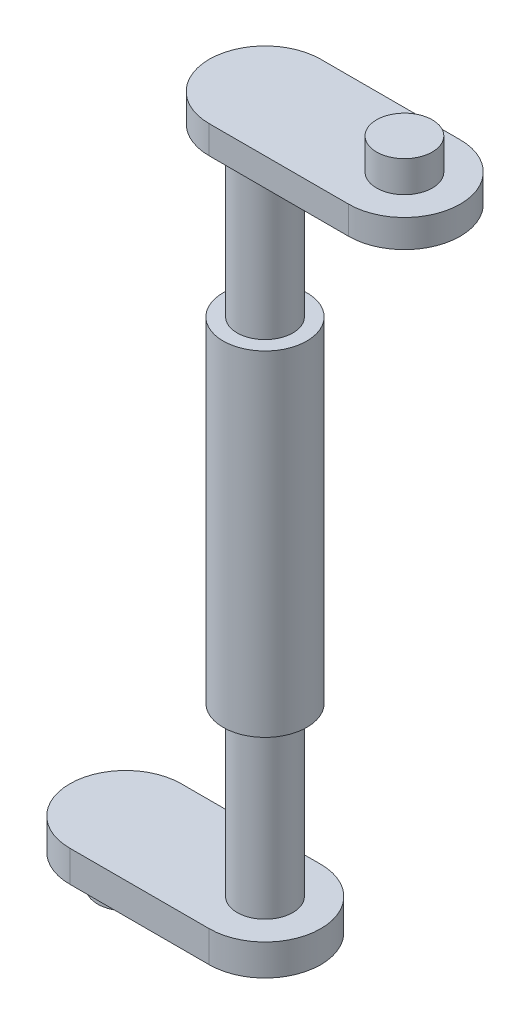
ISO-10303-21;
HEADER;
FILE_DESCRIPTION(('STEP AP214'),'2;1');
FILE_NAME('part.step','',(''),(''),'','','');
FILE_SCHEMA(('AUTOMOTIVE_DESIGN { 1 0 10303 214 1 1 1 1 }'));
ENDSEC;
DATA;
#1=APPLICATION_CONTEXT('core data for automotive mechanical design processes');
#2=APPLICATION_PROTOCOL_DEFINITION('international standard','automotive_design',2000,#1);
#3=PRODUCT_CONTEXT('',#1,'mechanical');
#4=PRODUCT('Part','Part','',(#3));
#5=PRODUCT_RELATED_PRODUCT_CATEGORY('part','',(#4));
#6=PRODUCT_DEFINITION_FORMATION('','',#4);
#7=PRODUCT_DEFINITION_CONTEXT('part definition',#1,'design');
#8=PRODUCT_DEFINITION('design','',#6,#7);
#9=PRODUCT_DEFINITION_SHAPE('','',#8);
#10=(LENGTH_UNIT() NAMED_UNIT(*) SI_UNIT(.MILLI.,.METRE.));
#11=(NAMED_UNIT(*) PLANE_ANGLE_UNIT() SI_UNIT($,.RADIAN.));
#12=(NAMED_UNIT(*) SI_UNIT($,.STERADIAN.) SOLID_ANGLE_UNIT());
#13=UNCERTAINTY_MEASURE_WITH_UNIT(LENGTH_MEASURE(1.E-05),#10,'distance_accuracy_value','');
#14=(GEOMETRIC_REPRESENTATION_CONTEXT(3) GLOBAL_UNCERTAINTY_ASSIGNED_CONTEXT((#13)) GLOBAL_UNIT_ASSIGNED_CONTEXT((#10,
#11,#12)) REPRESENTATION_CONTEXT('',''));
#15=CARTESIAN_POINT('',(0.,0.,0.));
#16=DIRECTION('',(0.,0.,1.));
#17=DIRECTION('',(1.,0.,0.));
#18=AXIS2_PLACEMENT_3D('',#15,#16,#17);
#19=CARTESIAN_POINT('',(0.,30.,0.));
#20=DIRECTION('',(0.,-1.,0.));
#21=DIRECTION('',(0.,0.,-1.));
#22=AXIS2_PLACEMENT_3D('',#19,#20,#21);
#23=CYLINDRICAL_SURFACE('',#22,2.5);
#24=CARTESIAN_POINT('',(0.,15.,0.));
#25=DIRECTION('',(0.,1.,0.));
#26=DIRECTION('',(0.,0.,1.));
#27=AXIS2_PLACEMENT_3D('',#24,#25,#26);
#28=CIRCLE('',#27,2.5);
#29=CARTESIAN_POINT('',(0.,15.,2.5));
#30=VERTEX_POINT('',#29);
#31=EDGE_CURVE('E36',#30,#30,#28,.T.);
#32=ORIENTED_EDGE('',*,*,#31,.T.);
#33=EDGE_LOOP('',(#32));
#34=FACE_BOUND('',#33,.T.);
#35=CARTESIAN_POINT('',(0.,30.,0.));
#36=DIRECTION('',(0.,1.,0.));
#37=DIRECTION('',(0.,0.,1.));
#38=AXIS2_PLACEMENT_3D('',#35,#36,#37);
#39=CIRCLE('',#38,2.5);
#40=CARTESIAN_POINT('',(0.,30.,2.5));
#41=VERTEX_POINT('',#40);
#42=EDGE_CURVE('E42',#41,#41,#39,.T.);
#43=ORIENTED_EDGE('',*,*,#42,.F.);
#44=EDGE_LOOP('',(#43));
#45=FACE_BOUND('',#44,.T.);
#46=ADVANCED_FACE('F33',(#34,#45),#23,.T.);
#47=CARTESIAN_POINT('',(0.,15.,0.));
#48=DIRECTION('',(0.,-1.,0.));
#49=DIRECTION('',(0.,0.,-1.));
#50=AXIS2_PLACEMENT_3D('',#47,#48,#49);
#51=CYLINDRICAL_SURFACE('',#50,3.75);
#52=CARTESIAN_POINT('',(0.,15.,0.));
#53=DIRECTION('',(0.,1.,0.));
#54=DIRECTION('',(0.,0.,1.));
#55=AXIS2_PLACEMENT_3D('',#52,#53,#54);
#56=CIRCLE('',#55,3.75);
#57=CARTESIAN_POINT('',(0.,15.,3.75));
#58=VERTEX_POINT('',#57);
#59=EDGE_CURVE('E170',#58,#58,#56,.T.);
#60=ORIENTED_EDGE('',*,*,#59,.F.);
#61=EDGE_LOOP('',(#60));
#62=FACE_BOUND('',#61,.T.);
#63=CARTESIAN_POINT('',(0.,-15.,0.));
#64=DIRECTION('',(0.,1.,0.));
#65=DIRECTION('',(0.,0.,1.));
#66=AXIS2_PLACEMENT_3D('',#63,#64,#65);
#67=CIRCLE('',#66,3.75);
#68=CARTESIAN_POINT('',(0.,-15.,3.75));
#69=VERTEX_POINT('',#68);
#70=EDGE_CURVE('E169',#69,#69,#67,.T.);
#71=ORIENTED_EDGE('',*,*,#70,.T.);
#72=EDGE_LOOP('',(#71));
#73=FACE_BOUND('',#72,.T.);
#74=ADVANCED_FACE('F187',(#62,#73),#51,.T.);
#75=CARTESIAN_POINT('',(0.,15.,0.));
#76=DIRECTION('',(0.,1.,0.));
#77=DIRECTION('',(0.,0.,1.));
#78=AXIS2_PLACEMENT_3D('',#75,#76,#77);
#79=PLANE('',#78);
#80=ORIENTED_EDGE('',*,*,#31,.F.);
#81=EDGE_LOOP('',(#80));
#82=FACE_BOUND('',#81,.T.);
#83=ORIENTED_EDGE('',*,*,#59,.T.);
#84=EDGE_LOOP('',(#83));
#85=FACE_BOUND('',#84,.T.);
#86=ADVANCED_FACE('F183',(#82,#85),#79,.T.);
#87=CARTESIAN_POINT('',(0.,-15.,0.));
#88=DIRECTION('',(0.,1.,0.));
#89=DIRECTION('',(0.,0.,1.));
#90=AXIS2_PLACEMENT_3D('',#87,#88,#89);
#91=PLANE('',#90);
#92=CARTESIAN_POINT('',(0.,-15.,0.));
#93=DIRECTION('',(0.,1.,0.));
#94=DIRECTION('',(0.,0.,1.));
#95=AXIS2_PLACEMENT_3D('',#92,#93,#94);
#96=CIRCLE('',#95,2.5);
#97=CARTESIAN_POINT('',(0.,-15.,2.5));
#98=VERTEX_POINT('',#97);
#99=EDGE_CURVE('E11',#98,#98,#96,.T.);
#100=ORIENTED_EDGE('',*,*,#99,.T.);
#101=EDGE_LOOP('',(#100));
#102=FACE_BOUND('',#101,.T.);
#103=ORIENTED_EDGE('',*,*,#70,.F.);
#104=EDGE_LOOP('',(#103));
#105=FACE_BOUND('',#104,.T.);
#106=ADVANCED_FACE('F186',(#102,#105),#91,.F.);
#107=CARTESIAN_POINT('',(0.,-30.,0.));
#108=DIRECTION('',(0.,1.,0.));
#109=DIRECTION('',(0.,0.,1.));
#110=AXIS2_PLACEMENT_3D('',#107,#108,#109);
#111=CIRCLE('',#110,2.5);
#112=CARTESIAN_POINT('',(0.,-30.,2.5));
#113=VERTEX_POINT('',#112);
#114=EDGE_CURVE('E134',#113,#113,#111,.T.);
#115=ORIENTED_EDGE('',*,*,#114,.T.);
#116=EDGE_LOOP('',(#115));
#117=FACE_BOUND('',#116,.T.);
#118=ORIENTED_EDGE('',*,*,#99,.F.);
#119=EDGE_LOOP('',(#118));
#120=FACE_BOUND('',#119,.T.);
#121=ADVANCED_FACE('F196',(#117,#120),#23,.T.);
#122=CARTESIAN_POINT('',(0.,32.5,0.));
#123=DIRECTION('',(0.,-1.,0.));
#124=DIRECTION('',(0.,0.,-1.));
#125=AXIS2_PLACEMENT_3D('',#122,#123,#124);
#126=CYLINDRICAL_SURFACE('',#125,5.);
#127=CARTESIAN_POINT('',(0.,30.,0.));
#128=DIRECTION('',(0.,1.,0.));
#129=DIRECTION('',(0.,0.,1.));
#130=AXIS2_PLACEMENT_3D('',#127,#128,#129);
#131=CIRCLE('',#130,5.);
#132=CARTESIAN_POINT('',(0.,30.,-5.));
#133=VERTEX_POINT('',#132);
#134=CARTESIAN_POINT('',(0.,30.,5.));
#135=VERTEX_POINT('',#134);
#136=EDGE_CURVE('E146',#133,#135,#131,.T.);
#137=ORIENTED_EDGE('',*,*,#136,.T.);
#138=DIRECTION('',(0.,-1.,0.));
#139=VECTOR('',#138,1.);
#140=CARTESIAN_POINT('',(0.,32.5,5.));
#141=LINE('',#140,#139);
#142=CARTESIAN_POINT('',(0.,32.5,5.));
#143=VERTEX_POINT('',#142);
#144=EDGE_CURVE('E167',#143,#135,#141,.T.);
#145=ORIENTED_EDGE('',*,*,#144,.F.);
#146=CARTESIAN_POINT('',(0.,32.5,0.));
#147=DIRECTION('',(0.,1.,0.));
#148=DIRECTION('',(0.,0.,1.));
#149=AXIS2_PLACEMENT_3D('',#146,#147,#148);
#150=CIRCLE('',#149,5.);
#151=CARTESIAN_POINT('',(0.,32.5,-5.));
#152=VERTEX_POINT('',#151);
#153=EDGE_CURVE('E149',#152,#143,#150,.T.);
#154=ORIENTED_EDGE('',*,*,#153,.F.);
#155=DIRECTION('',(0.,-1.,0.));
#156=VECTOR('',#155,1.);
#157=CARTESIAN_POINT('',(0.,32.5,-5.));
#158=LINE('',#157,#156);
#159=EDGE_CURVE('E155',#152,#133,#158,.T.);
#160=ORIENTED_EDGE('',*,*,#159,.T.);
#161=EDGE_LOOP('',(#137,#145,#154,#160));
#162=FACE_BOUND('',#161,.T.);
#163=ADVANCED_FACE('F202',(#162),#126,.T.);
#164=CARTESIAN_POINT('',(0.,32.5,5.));
#165=DIRECTION('',(0.,0.,-1.));
#166=DIRECTION('',(-1.,0.,0.));
#167=AXIS2_PLACEMENT_3D('',#164,#165,#166);
#168=PLANE('',#167);
#169=DIRECTION('',(1.,0.,0.));
#170=VECTOR('',#169,1.);
#171=CARTESIAN_POINT('',(0.,30.,5.));
#172=LINE('',#171,#170);
#173=CARTESIAN_POINT('',(12.5,30.,5.));
#174=VERTEX_POINT('',#173);
#175=EDGE_CURVE('E158',#135,#174,#172,.T.);
#176=ORIENTED_EDGE('',*,*,#175,.T.);
#177=DIRECTION('',(0.,-1.,0.));
#178=VECTOR('',#177,1.);
#179=CARTESIAN_POINT('',(12.5,32.5,5.));
#180=LINE('',#179,#178);
#181=CARTESIAN_POINT('',(12.5,32.5,5.));
#182=VERTEX_POINT('',#181);
#183=EDGE_CURVE('E165',#182,#174,#180,.T.);
#184=ORIENTED_EDGE('',*,*,#183,.F.);
#185=DIRECTION('',(1.,0.,0.));
#186=VECTOR('',#185,1.);
#187=CARTESIAN_POINT('',(0.,32.5,5.));
#188=LINE('',#187,#186);
#189=EDGE_CURVE('E82',#143,#182,#188,.T.);
#190=ORIENTED_EDGE('',*,*,#189,.F.);
#191=ORIENTED_EDGE('',*,*,#144,.T.);
#192=EDGE_LOOP('',(#176,#184,#190,#191));
#193=FACE_BOUND('',#192,.T.);
#194=ADVANCED_FACE('F234',(#193),#168,.F.);
#195=CARTESIAN_POINT('',(12.5,32.5,0.));
#196=DIRECTION('',(0.,-1.,0.));
#197=DIRECTION('',(0.,0.,-1.));
#198=AXIS2_PLACEMENT_3D('',#195,#196,#197);
#199=CYLINDRICAL_SURFACE('',#198,5.);
#200=CARTESIAN_POINT('',(12.5,30.,0.));
#201=DIRECTION('',(0.,1.,0.));
#202=DIRECTION('',(0.,0.,1.));
#203=AXIS2_PLACEMENT_3D('',#200,#201,#202);
#204=CIRCLE('',#203,5.);
#205=CARTESIAN_POINT('',(12.5,30.,-5.));
#206=VERTEX_POINT('',#205);
#207=EDGE_CURVE('E68',#174,#206,#204,.T.);
#208=ORIENTED_EDGE('',*,*,#207,.T.);
#209=DIRECTION('',(0.,-1.,0.));
#210=VECTOR('',#209,1.);
#211=CARTESIAN_POINT('',(12.5,32.5,-5.));
#212=LINE('',#211,#210);
#213=CARTESIAN_POINT('',(12.5,32.5,-5.));
#214=VERTEX_POINT('',#213);
#215=EDGE_CURVE('E163',#214,#206,#212,.T.);
#216=ORIENTED_EDGE('',*,*,#215,.F.);
#217=CARTESIAN_POINT('',(12.5,32.5,0.));
#218=DIRECTION('',(0.,1.,0.));
#219=DIRECTION('',(0.,0.,1.));
#220=AXIS2_PLACEMENT_3D('',#217,#218,#219);
#221=CIRCLE('',#220,5.);
#222=EDGE_CURVE('E152',#182,#214,#221,.T.);
#223=ORIENTED_EDGE('',*,*,#222,.F.);
#224=ORIENTED_EDGE('',*,*,#183,.T.);
#225=EDGE_LOOP('',(#208,#216,#223,#224));
#226=FACE_BOUND('',#225,.T.);
#227=ADVANCED_FACE('F244',(#226),#199,.T.);
#228=CARTESIAN_POINT('',(0.,32.5,-5.));
#229=DIRECTION('',(0.,0.,1.));
#230=DIRECTION('',(1.,0.,0.));
#231=AXIS2_PLACEMENT_3D('',#228,#229,#230);
#232=PLANE('',#231);
#233=DIRECTION('',(-1.,0.,0.));
#234=VECTOR('',#233,1.);
#235=CARTESIAN_POINT('',(0.,30.,-5.));
#236=LINE('',#235,#234);
#237=EDGE_CURVE('E74',#206,#133,#236,.T.);
#238=ORIENTED_EDGE('',*,*,#237,.T.);
#239=ORIENTED_EDGE('',*,*,#159,.F.);
#240=DIRECTION('',(-1.,0.,0.));
#241=VECTOR('',#240,1.);
#242=CARTESIAN_POINT('',(0.,32.5,-5.));
#243=LINE('',#242,#241);
#244=EDGE_CURVE('E50',#214,#152,#243,.T.);
#245=ORIENTED_EDGE('',*,*,#244,.F.);
#246=ORIENTED_EDGE('',*,*,#215,.T.);
#247=EDGE_LOOP('',(#238,#239,#245,#246));
#248=FACE_BOUND('',#247,.T.);
#249=ADVANCED_FACE('F253',(#248),#232,.F.);
#250=CARTESIAN_POINT('',(0.,32.5,0.));
#251=DIRECTION('',(0.,1.,0.));
#252=DIRECTION('',(0.,0.,1.));
#253=AXIS2_PLACEMENT_3D('',#250,#251,#252);
#254=PLANE('',#253);
#255=CARTESIAN_POINT('',(12.5,32.5,0.));
#256=DIRECTION('',(0.,1.,0.));
#257=DIRECTION('',(0.,0.,1.));
#258=AXIS2_PLACEMENT_3D('',#255,#256,#257);
#259=CIRCLE('',#258,2.5);
#260=CARTESIAN_POINT('',(12.5,32.5,2.5));
#261=VERTEX_POINT('',#260);
#262=EDGE_CURVE('E137',#261,#261,#259,.T.);
#263=ORIENTED_EDGE('',*,*,#262,.F.);
#264=EDGE_LOOP('',(#263));
#265=FACE_BOUND('',#264,.T.);
#266=ORIENTED_EDGE('',*,*,#153,.T.);
#267=ORIENTED_EDGE('',*,*,#189,.T.);
#268=ORIENTED_EDGE('',*,*,#222,.T.);
#269=ORIENTED_EDGE('',*,*,#244,.T.);
#270=EDGE_LOOP('',(#266,#267,#268,#269));
#271=FACE_BOUND('',#270,.T.);
#272=ADVANCED_FACE('F262',(#265,#271),#254,.T.);
#273=CARTESIAN_POINT('',(0.,30.,0.));
#274=DIRECTION('',(0.,1.,0.));
#275=DIRECTION('',(0.,0.,1.));
#276=AXIS2_PLACEMENT_3D('',#273,#274,#275);
#277=PLANE('',#276);
#278=ORIENTED_EDGE('',*,*,#42,.T.);
#279=EDGE_LOOP('',(#278));
#280=FACE_BOUND('',#279,.T.);
#281=ORIENTED_EDGE('',*,*,#136,.F.);
#282=ORIENTED_EDGE('',*,*,#237,.F.);
#283=ORIENTED_EDGE('',*,*,#207,.F.);
#284=ORIENTED_EDGE('',*,*,#175,.F.);
#285=EDGE_LOOP('',(#281,#282,#283,#284));
#286=FACE_BOUND('',#285,.T.);
#287=ADVANCED_FACE('F269',(#280,#286),#277,.F.);
#288=CARTESIAN_POINT('',(12.5,35.3,0.));
#289=DIRECTION('',(0.,-1.,0.));
#290=DIRECTION('',(0.,0.,-1.));
#291=AXIS2_PLACEMENT_3D('',#288,#289,#290);
#292=CYLINDRICAL_SURFACE('',#291,2.5);
#293=CARTESIAN_POINT('',(12.5,35.3,0.));
#294=DIRECTION('',(0.,1.,0.));
#295=DIRECTION('',(0.,0.,1.));
#296=AXIS2_PLACEMENT_3D('',#293,#294,#295);
#297=CIRCLE('',#296,2.5);
#298=CARTESIAN_POINT('',(12.5,35.3,2.5));
#299=VERTEX_POINT('',#298);
#300=EDGE_CURVE('E143',#299,#299,#297,.T.);
#301=ORIENTED_EDGE('',*,*,#300,.F.);
#302=EDGE_LOOP('',(#301));
#303=FACE_BOUND('',#302,.T.);
#304=ORIENTED_EDGE('',*,*,#262,.T.);
#305=EDGE_LOOP('',(#304));
#306=FACE_BOUND('',#305,.T.);
#307=ADVANCED_FACE('F274',(#303,#306),#292,.T.);
#308=CARTESIAN_POINT('',(12.5,35.3,0.));
#309=DIRECTION('',(0.,1.,0.));
#310=DIRECTION('',(0.,0.,1.));
#311=AXIS2_PLACEMENT_3D('',#308,#309,#310);
#312=PLANE('',#311);
#313=ORIENTED_EDGE('',*,*,#300,.T.);
#314=EDGE_LOOP('',(#313));
#315=FACE_BOUND('',#314,.T.);
#316=ADVANCED_FACE('F290',(#315),#312,.T.);
#317=CARTESIAN_POINT('',(0.,-32.8,0.));
#318=DIRECTION('',(0.,1.,0.));
#319=DIRECTION('',(0.,0.,1.));
#320=AXIS2_PLACEMENT_3D('',#317,#318,#319);
#321=CYLINDRICAL_SURFACE('',#320,5.);
#322=CARTESIAN_POINT('',(0.,-30.,0.));
#323=DIRECTION('',(0.,-1.,0.));
#324=DIRECTION('',(0.,0.,-1.));
#325=AXIS2_PLACEMENT_3D('',#322,#323,#324);
#326=CIRCLE('',#325,5.);
#327=CARTESIAN_POINT('',(0.,-30.,-5.));
#328=VERTEX_POINT('',#327);
#329=CARTESIAN_POINT('',(0.,-30.,5.));
#330=VERTEX_POINT('',#329);
#331=EDGE_CURVE('E133',#328,#330,#326,.T.);
#332=ORIENTED_EDGE('',*,*,#331,.T.);
#333=DIRECTION('',(0.,1.,0.));
#334=VECTOR('',#333,1.);
#335=CARTESIAN_POINT('',(0.,-32.8,5.));
#336=LINE('',#335,#334);
#337=CARTESIAN_POINT('',(0.,-32.8,5.));
#338=VERTEX_POINT('',#337);
#339=EDGE_CURVE('E113',#338,#330,#336,.T.);
#340=ORIENTED_EDGE('',*,*,#339,.F.);
#341=CARTESIAN_POINT('',(0.,-32.8,0.));
#342=DIRECTION('',(0.,-1.,0.));
#343=DIRECTION('',(0.,0.,-1.));
#344=AXIS2_PLACEMENT_3D('',#341,#342,#343);
#345=CIRCLE('',#344,5.);
#346=CARTESIAN_POINT('',(0.,-32.8,-5.));
#347=VERTEX_POINT('',#346);
#348=EDGE_CURVE('E120',#347,#338,#345,.T.);
#349=ORIENTED_EDGE('',*,*,#348,.F.);
#350=DIRECTION('',(0.,1.,0.));
#351=VECTOR('',#350,1.);
#352=CARTESIAN_POINT('',(0.,-32.8,-5.));
#353=LINE('',#352,#351);
#354=EDGE_CURVE('E390',#347,#328,#353,.T.);
#355=ORIENTED_EDGE('',*,*,#354,.T.);
#356=EDGE_LOOP('',(#332,#340,#349,#355));
#357=FACE_BOUND('',#356,.T.);
#358=ADVANCED_FACE('F131',(#357),#321,.T.);
#359=CARTESIAN_POINT('',(0.,-32.8,5.));
#360=DIRECTION('',(0.,0.,-1.));
#361=DIRECTION('',(-1.,0.,0.));
#362=AXIS2_PLACEMENT_3D('',#359,#360,#361);
#363=PLANE('',#362);
#364=DIRECTION('',(-1.,0.,0.));
#365=VECTOR('',#364,1.);
#366=CARTESIAN_POINT('',(0.,-30.,5.));
#367=LINE('',#366,#365);
#368=CARTESIAN_POINT('',(-12.5,-30.,5.));
#369=VERTEX_POINT('',#368);
#370=EDGE_CURVE('E384',#330,#369,#367,.T.);
#371=ORIENTED_EDGE('',*,*,#370,.T.);
#372=DIRECTION('',(0.,1.,0.));
#373=VECTOR('',#372,1.);
#374=CARTESIAN_POINT('',(-12.5,-32.8,5.));
#375=LINE('',#374,#373);
#376=CARTESIAN_POINT('',(-12.5,-32.8,5.));
#377=VERTEX_POINT('',#376);
#378=EDGE_CURVE('E116',#377,#369,#375,.T.);
#379=ORIENTED_EDGE('',*,*,#378,.F.);
#380=DIRECTION('',(-1.,0.,0.));
#381=VECTOR('',#380,1.);
#382=CARTESIAN_POINT('',(0.,-32.8,5.));
#383=LINE('',#382,#381);
#384=EDGE_CURVE('E109',#338,#377,#383,.T.);
#385=ORIENTED_EDGE('',*,*,#384,.F.);
#386=ORIENTED_EDGE('',*,*,#339,.T.);
#387=EDGE_LOOP('',(#371,#379,#385,#386));
#388=FACE_BOUND('',#387,.T.);
#389=ADVANCED_FACE('F111',(#388),#363,.F.);
#390=CARTESIAN_POINT('',(-12.5,-32.8,0.));
#391=DIRECTION('',(0.,1.,0.));
#392=DIRECTION('',(0.,0.,1.));
#393=AXIS2_PLACEMENT_3D('',#390,#391,#392);
#394=CYLINDRICAL_SURFACE('',#393,5.);
#395=CARTESIAN_POINT('',(-12.5,-30.,0.));
#396=DIRECTION('',(0.,-1.,0.));
#397=DIRECTION('',(0.,0.,-1.));
#398=AXIS2_PLACEMENT_3D('',#395,#396,#397);
#399=CIRCLE('',#398,5.);
#400=CARTESIAN_POINT('',(-12.5,-30.,-5.));
#401=VERTEX_POINT('',#400);
#402=EDGE_CURVE('E393',#369,#401,#399,.T.);
#403=ORIENTED_EDGE('',*,*,#402,.T.);
#404=DIRECTION('',(0.,1.,0.));
#405=VECTOR('',#404,1.);
#406=CARTESIAN_POINT('',(-12.5,-32.8,-5.));
#407=LINE('',#406,#405);
#408=CARTESIAN_POINT('',(-12.5,-32.8,-5.));
#409=VERTEX_POINT('',#408);
#410=EDGE_CURVE('E139',#409,#401,#407,.T.);
#411=ORIENTED_EDGE('',*,*,#410,.F.);
#412=CARTESIAN_POINT('',(-12.5,-32.8,0.));
#413=DIRECTION('',(0.,-1.,0.));
#414=DIRECTION('',(0.,0.,-1.));
#415=AXIS2_PLACEMENT_3D('',#412,#413,#414);
#416=CIRCLE('',#415,5.);
#417=EDGE_CURVE('E119',#377,#409,#416,.T.);
#418=ORIENTED_EDGE('',*,*,#417,.F.);
#419=ORIENTED_EDGE('',*,*,#378,.T.);
#420=EDGE_LOOP('',(#403,#411,#418,#419));
#421=FACE_BOUND('',#420,.T.);
#422=ADVANCED_FACE('F317',(#421),#394,.T.);
#423=CARTESIAN_POINT('',(0.,-32.8,-5.));
#424=DIRECTION('',(0.,0.,1.));
#425=DIRECTION('',(1.,0.,0.));
#426=AXIS2_PLACEMENT_3D('',#423,#424,#425);
#427=PLANE('',#426);
#428=DIRECTION('',(1.,0.,0.));
#429=VECTOR('',#428,1.);
#430=CARTESIAN_POINT('',(0.,-30.,-5.));
#431=LINE('',#430,#429);
#432=EDGE_CURVE('E129',#401,#328,#431,.T.);
#433=ORIENTED_EDGE('',*,*,#432,.T.);
#434=ORIENTED_EDGE('',*,*,#354,.F.);
#435=DIRECTION('',(1.,0.,0.));
#436=VECTOR('',#435,1.);
#437=CARTESIAN_POINT('',(0.,-32.8,-5.));
#438=LINE('',#437,#436);
#439=EDGE_CURVE('E125',#409,#347,#438,.T.);
#440=ORIENTED_EDGE('',*,*,#439,.F.);
#441=ORIENTED_EDGE('',*,*,#410,.T.);
#442=EDGE_LOOP('',(#433,#434,#440,#441));
#443=FACE_BOUND('',#442,.T.);
#444=ADVANCED_FACE('F326',(#443),#427,.F.);
#445=CARTESIAN_POINT('',(0.,-32.8,0.));
#446=DIRECTION('',(0.,-1.,0.));
#447=DIRECTION('',(0.,0.,-1.));
#448=AXIS2_PLACEMENT_3D('',#445,#446,#447);
#449=PLANE('',#448);
#450=CARTESIAN_POINT('',(-12.5,-32.8,0.));
#451=DIRECTION('',(0.,-1.,0.));
#452=DIRECTION('',(0.,0.,-1.));
#453=AXIS2_PLACEMENT_3D('',#450,#451,#452);
#454=CIRCLE('',#453,2.5);
#455=CARTESIAN_POINT('',(-12.5,-32.8,-2.5));
#456=VERTEX_POINT('',#455);
#457=EDGE_CURVE('E382',#456,#456,#454,.T.);
#458=ORIENTED_EDGE('',*,*,#457,.F.);
#459=EDGE_LOOP('',(#458));
#460=FACE_BOUND('',#459,.T.);
#461=ORIENTED_EDGE('',*,*,#348,.T.);
#462=ORIENTED_EDGE('',*,*,#384,.T.);
#463=ORIENTED_EDGE('',*,*,#417,.T.);
#464=ORIENTED_EDGE('',*,*,#439,.T.);
#465=EDGE_LOOP('',(#461,#462,#463,#464));
#466=FACE_BOUND('',#465,.T.);
#467=ADVANCED_FACE('F123',(#460,#466),#449,.T.);
#468=CARTESIAN_POINT('',(0.,-30.,0.));
#469=DIRECTION('',(0.,-1.,0.));
#470=DIRECTION('',(0.,0.,-1.));
#471=AXIS2_PLACEMENT_3D('',#468,#469,#470);
#472=PLANE('',#471);
#473=ORIENTED_EDGE('',*,*,#114,.F.);
#474=EDGE_LOOP('',(#473));
#475=FACE_BOUND('',#474,.T.);
#476=ORIENTED_EDGE('',*,*,#331,.F.);
#477=ORIENTED_EDGE('',*,*,#432,.F.);
#478=ORIENTED_EDGE('',*,*,#402,.F.);
#479=ORIENTED_EDGE('',*,*,#370,.F.);
#480=EDGE_LOOP('',(#476,#477,#478,#479));
#481=FACE_BOUND('',#480,.T.);
#482=ADVANCED_FACE('F343',(#475,#481),#472,.F.);
#483=CARTESIAN_POINT('',(-12.5,-35.6,0.));
#484=DIRECTION('',(0.,1.,0.));
#485=DIRECTION('',(0.,0.,1.));
#486=AXIS2_PLACEMENT_3D('',#483,#484,#485);
#487=CYLINDRICAL_SURFACE('',#486,2.5);
#488=CARTESIAN_POINT('',(-12.5,-35.6,0.));
#489=DIRECTION('',(0.,-1.,0.));
#490=DIRECTION('',(0.,0.,-1.));
#491=AXIS2_PLACEMENT_3D('',#488,#489,#490);
#492=CIRCLE('',#491,2.5);
#493=CARTESIAN_POINT('',(-12.5,-35.6,-2.5));
#494=VERTEX_POINT('',#493);
#495=EDGE_CURVE('E381',#494,#494,#492,.T.);
#496=ORIENTED_EDGE('',*,*,#495,.F.);
#497=EDGE_LOOP('',(#496));
#498=FACE_BOUND('',#497,.T.);
#499=ORIENTED_EDGE('',*,*,#457,.T.);
#500=EDGE_LOOP('',(#499));
#501=FACE_BOUND('',#500,.T.);
#502=ADVANCED_FACE('F348',(#498,#501),#487,.T.);
#503=CARTESIAN_POINT('',(-12.5,-35.6,0.));
#504=DIRECTION('',(0.,-1.,0.));
#505=DIRECTION('',(0.,0.,-1.));
#506=AXIS2_PLACEMENT_3D('',#503,#504,#505);
#507=PLANE('',#506);
#508=ORIENTED_EDGE('',*,*,#495,.T.);
#509=EDGE_LOOP('',(#508));
#510=FACE_BOUND('',#509,.T.);
#511=ADVANCED_FACE('F365',(#510),#507,.T.);
#512=CLOSED_SHELL('',(#46,#74,#86,#106,#121,#163,#194,#227,#249,#272,#287,#307,#316,#358,#389,
#422,#444,#467,#482,#502,#511));
#513=MANIFOLD_SOLID_BREP('B2',#512);
#514=ADVANCED_BREP_SHAPE_REPRESENTATION('',(#18,#513),#14);
#515=SHAPE_DEFINITION_REPRESENTATION(#9,#514);
ENDSEC;
END-ISO-10303-21;
